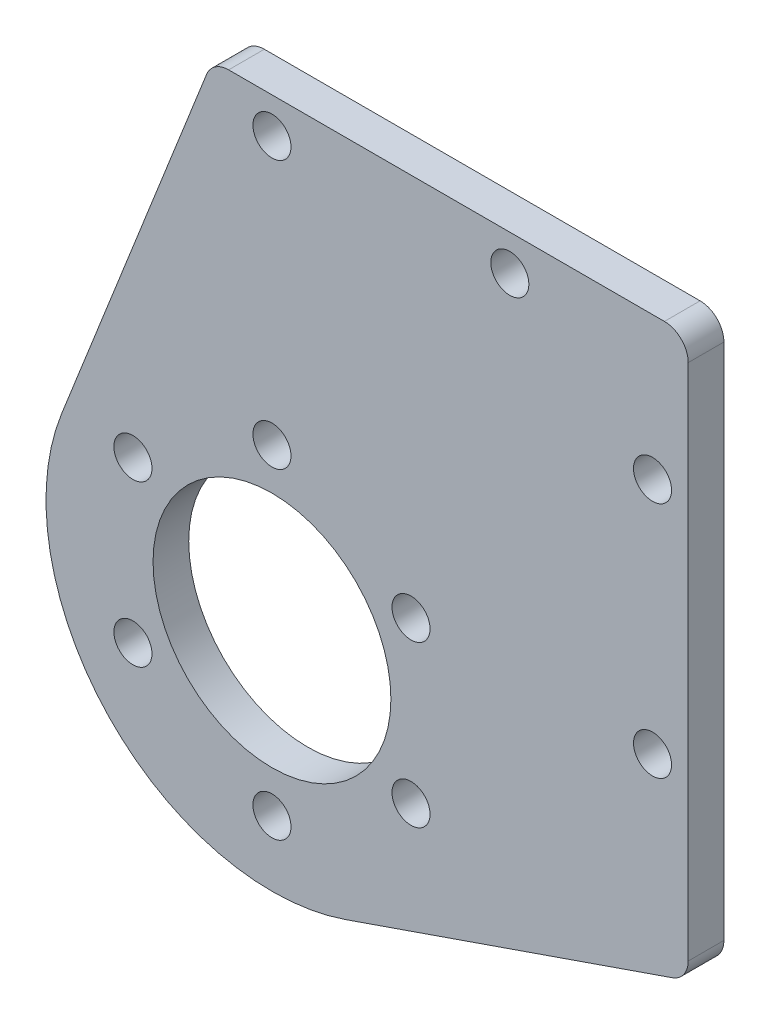
ISO-10303-21;
HEADER;
FILE_DESCRIPTION(('STEP AP214'),'2;1');
FILE_NAME('part.step','',(''),(''),'','','');
FILE_SCHEMA(('AUTOMOTIVE_DESIGN { 1 0 10303 214 1 1 1 1 }'));
ENDSEC;
DATA;
#1=APPLICATION_CONTEXT('core data for automotive mechanical design processes');
#2=APPLICATION_PROTOCOL_DEFINITION('international standard','automotive_design',2000,#1);
#3=PRODUCT_CONTEXT('',#1,'mechanical');
#4=PRODUCT('Part','Part','',(#3));
#5=PRODUCT_RELATED_PRODUCT_CATEGORY('part','',(#4));
#6=PRODUCT_DEFINITION_FORMATION('','',#4);
#7=PRODUCT_DEFINITION_CONTEXT('part definition',#1,'design');
#8=PRODUCT_DEFINITION('design','',#6,#7);
#9=PRODUCT_DEFINITION_SHAPE('','',#8);
#10=(LENGTH_UNIT() NAMED_UNIT(*) SI_UNIT(.MILLI.,.METRE.));
#11=(NAMED_UNIT(*) PLANE_ANGLE_UNIT() SI_UNIT($,.RADIAN.));
#12=(NAMED_UNIT(*) SI_UNIT($,.STERADIAN.) SOLID_ANGLE_UNIT());
#13=UNCERTAINTY_MEASURE_WITH_UNIT(LENGTH_MEASURE(1.E-05),#10,'distance_accuracy_value','');
#14=(GEOMETRIC_REPRESENTATION_CONTEXT(3) GLOBAL_UNCERTAINTY_ASSIGNED_CONTEXT((#13)) GLOBAL_UNIT_ASSIGNED_CONTEXT((#10,
#11,#12)) REPRESENTATION_CONTEXT('',''));
#15=CARTESIAN_POINT('',(0.,0.,0.));
#16=DIRECTION('',(0.,0.,1.));
#17=DIRECTION('',(1.,0.,0.));
#18=AXIS2_PLACEMENT_3D('',#15,#16,#17);
#19=CARTESIAN_POINT('',(0.,0.,3.));
#20=DIRECTION('',(0.,0.,1.));
#21=DIRECTION('',(1.,0.,0.));
#22=AXIS2_PLACEMENT_3D('',#19,#20,#21);
#23=PLANE('',#22);
#24=CARTESIAN_POINT('',(-11.6913429510899,-6.75000000000001,3.));
#25=DIRECTION('',(0.,0.,1.));
#26=DIRECTION('',(1.,0.,0.));
#27=AXIS2_PLACEMENT_3D('',#24,#25,#26);
#28=CIRCLE('',#27,1.6);
#29=CARTESIAN_POINT('',(-10.0913429510899,-6.75000000000001,3.));
#30=VERTEX_POINT('',#29);
#31=EDGE_CURVE('E183',#30,#30,#28,.T.);
#32=ORIENTED_EDGE('',*,*,#31,.F.);
#33=EDGE_LOOP('',(#32));
#34=FACE_BOUND('',#33,.T.);
#35=CARTESIAN_POINT('',(11.6913429510899,-6.75,3.));
#36=DIRECTION('',(0.,0.,1.));
#37=DIRECTION('',(1.,0.,0.));
#38=AXIS2_PLACEMENT_3D('',#35,#36,#37);
#39=CIRCLE('',#38,1.6);
#40=CARTESIAN_POINT('',(13.2913429510899,-6.75,3.));
#41=VERTEX_POINT('',#40);
#42=EDGE_CURVE('E195',#41,#41,#39,.T.);
#43=ORIENTED_EDGE('',*,*,#42,.F.);
#44=EDGE_LOOP('',(#43));
#45=FACE_BOUND('',#44,.T.);
#46=CARTESIAN_POINT('',(0.,13.5,3.));
#47=DIRECTION('',(0.,0.,1.));
#48=DIRECTION('',(1.,0.,0.));
#49=AXIS2_PLACEMENT_3D('',#46,#47,#48);
#50=CIRCLE('',#49,1.6);
#51=CARTESIAN_POINT('',(1.6,13.5,3.));
#52=VERTEX_POINT('',#51);
#53=EDGE_CURVE('E207',#52,#52,#50,.T.);
#54=ORIENTED_EDGE('',*,*,#53,.F.);
#55=EDGE_LOOP('',(#54));
#56=FACE_BOUND('',#55,.T.);
#57=CARTESIAN_POINT('',(0.,0.,3.));
#58=DIRECTION('',(0.,0.,1.));
#59=DIRECTION('',(1.,0.,0.));
#60=AXIS2_PLACEMENT_3D('',#57,#58,#59);
#61=CIRCLE('',#60,19.);
#62=CARTESIAN_POINT('',(-17.6669193120845,6.99142060101481,3.));
#63=VERTEX_POINT('',#62);
#64=CARTESIAN_POINT('',(6.20993789886327,-17.9565216924732,3.));
#65=VERTEX_POINT('',#64);
#66=EDGE_CURVE('E11',#63,#65,#61,.T.);
#67=ORIENTED_EDGE('',*,*,#66,.T.);
#68=DIRECTION('',(-0.945080089077538,-0.326838836782277,0.));
#69=VECTOR('',#68,1.);
#70=CARTESIAN_POINT('',(6.20993789886326,-17.9565216924732,3.));
#71=LINE('',#70,#69);
#72=CARTESIAN_POINT('',(33.6536776735646,-8.46560119950856,3.));
#73=VERTEX_POINT('',#72);
#74=EDGE_CURVE('E125',#73,#65,#71,.T.);
#75=ORIENTED_EDGE('',*,*,#74,.F.);
#76=CARTESIAN_POINT('',(33.,-6.57544102135349,3.));
#77=DIRECTION('',(0.,0.,1.));
#78=DIRECTION('',(1.,0.,0.));
#79=AXIS2_PLACEMENT_3D('',#76,#77,#78);
#80=CIRCLE('',#79,2.);
#81=CARTESIAN_POINT('',(35.,-6.57544102135349,3.));
#82=VERTEX_POINT('',#81);
#83=EDGE_CURVE('E110',#82,#73,#80,.F.);
#84=ORIENTED_EDGE('',*,*,#83,.F.);
#85=DIRECTION('',(0.,1.,0.));
#86=VECTOR('',#85,1.);
#87=CARTESIAN_POINT('',(35.,0.,3.));
#88=LINE('',#87,#86);
#89=CARTESIAN_POINT('',(35.,37.,3.));
#90=VERTEX_POINT('',#89);
#91=EDGE_CURVE('E123',#82,#90,#88,.T.);
#92=ORIENTED_EDGE('',*,*,#91,.T.);
#93=CARTESIAN_POINT('',(33.,37.,3.));
#94=DIRECTION('',(0.,0.,1.));
#95=DIRECTION('',(1.,0.,0.));
#96=AXIS2_PLACEMENT_3D('',#93,#94,#95);
#97=CIRCLE('',#96,2.00000000000001);
#98=CARTESIAN_POINT('',(33.,39.,3.));
#99=VERTEX_POINT('',#98);
#100=EDGE_CURVE('E130',#90,#99,#97,.T.);
#101=ORIENTED_EDGE('',*,*,#100,.T.);
#102=DIRECTION('',(-1.,0.,0.));
#103=VECTOR('',#102,1.);
#104=CARTESIAN_POINT('',(0.,39.,3.));
#105=LINE('',#104,#103);
#106=CARTESIAN_POINT('',(-3.64055762220285,39.,3.));
#107=VERTEX_POINT('',#106);
#108=EDGE_CURVE('E132',#99,#107,#105,.T.);
#109=ORIENTED_EDGE('',*,*,#108,.T.);
#110=CARTESIAN_POINT('',(-3.64055762220285,37.,3.));
#111=DIRECTION('',(0.,0.,1.));
#112=DIRECTION('',(1.,0.,0.));
#113=AXIS2_PLACEMENT_3D('',#110,#111,#112);
#114=CIRCLE('',#113,2.);
#115=CARTESIAN_POINT('',(-5.50023333926439,37.7359390106331,3.));
#116=VERTEX_POINT('',#115);
#117=EDGE_CURVE('E138',#107,#116,#114,.T.);
#118=ORIENTED_EDGE('',*,*,#117,.T.);
#119=DIRECTION('',(-0.367969505316569,-0.929837858530765,0.));
#120=VECTOR('',#119,1.);
#121=CARTESIAN_POINT('',(-17.6669193120845,6.99142060101481,3.));
#122=LINE('',#121,#120);
#123=EDGE_CURVE('E141',#116,#63,#122,.T.);
#124=ORIENTED_EDGE('',*,*,#123,.T.);
#125=EDGE_LOOP('',(#67,#75,#84,#92,#101,#109,#118,#124));
#126=FACE_BOUND('',#125,.T.);
#127=CARTESIAN_POINT('',(0.,0.,3.));
#128=DIRECTION('',(0.,0.,1.));
#129=DIRECTION('',(1.,0.,0.));
#130=AXIS2_PLACEMENT_3D('',#127,#128,#129);
#131=CIRCLE('',#130,10.);
#132=CARTESIAN_POINT('',(10.,0.,3.));
#133=VERTEX_POINT('',#132);
#134=EDGE_CURVE('E213',#133,#133,#131,.T.);
#135=ORIENTED_EDGE('',*,*,#134,.F.);
#136=EDGE_LOOP('',(#135));
#137=FACE_BOUND('',#136,.T.);
#138=CARTESIAN_POINT('',(11.6913429510899,6.75,3.));
#139=DIRECTION('',(0.,0.,1.));
#140=DIRECTION('',(1.,0.,0.));
#141=AXIS2_PLACEMENT_3D('',#138,#139,#140);
#142=CIRCLE('',#141,1.6);
#143=CARTESIAN_POINT('',(13.2913429510899,6.75,3.));
#144=VERTEX_POINT('',#143);
#145=EDGE_CURVE('E201',#144,#144,#142,.T.);
#146=ORIENTED_EDGE('',*,*,#145,.F.);
#147=EDGE_LOOP('',(#146));
#148=FACE_BOUND('',#147,.T.);
#149=CARTESIAN_POINT('',(0.,-13.5,3.));
#150=DIRECTION('',(0.,0.,1.));
#151=DIRECTION('',(1.,0.,0.));
#152=AXIS2_PLACEMENT_3D('',#149,#150,#151);
#153=CIRCLE('',#152,1.6);
#154=CARTESIAN_POINT('',(1.6,-13.5,3.));
#155=VERTEX_POINT('',#154);
#156=EDGE_CURVE('E189',#155,#155,#153,.T.);
#157=ORIENTED_EDGE('',*,*,#156,.F.);
#158=EDGE_LOOP('',(#157));
#159=FACE_BOUND('',#158,.T.);
#160=CARTESIAN_POINT('',(-11.6913429510899,6.75,3.));
#161=DIRECTION('',(0.,0.,1.));
#162=DIRECTION('',(1.,0.,0.));
#163=AXIS2_PLACEMENT_3D('',#160,#161,#162);
#164=CIRCLE('',#163,1.6);
#165=CARTESIAN_POINT('',(-10.0913429510899,6.75,3.));
#166=VERTEX_POINT('',#165);
#167=EDGE_CURVE('E175',#166,#166,#164,.T.);
#168=ORIENTED_EDGE('',*,*,#167,.F.);
#169=EDGE_LOOP('',(#168));
#170=FACE_BOUND('',#169,.T.);
#171=CARTESIAN_POINT('',(20.,36.,3.));
#172=DIRECTION('',(0.,0.,1.));
#173=DIRECTION('',(1.,0.,0.));
#174=AXIS2_PLACEMENT_3D('',#171,#172,#173);
#175=CIRCLE('',#174,1.6);
#176=CARTESIAN_POINT('',(21.6,36.,3.));
#177=VERTEX_POINT('',#176);
#178=EDGE_CURVE('E145',#177,#177,#175,.T.);
#179=ORIENTED_EDGE('',*,*,#178,.F.);
#180=EDGE_LOOP('',(#179));
#181=FACE_BOUND('',#180,.T.);
#182=CARTESIAN_POINT('',(0.,36.,3.));
#183=DIRECTION('',(0.,0.,1.));
#184=DIRECTION('',(1.,0.,0.));
#185=AXIS2_PLACEMENT_3D('',#182,#183,#184);
#186=CIRCLE('',#185,1.6);
#187=CARTESIAN_POINT('',(1.6,36.,3.));
#188=VERTEX_POINT('',#187);
#189=EDGE_CURVE('E148',#188,#188,#186,.T.);
#190=ORIENTED_EDGE('',*,*,#189,.F.);
#191=EDGE_LOOP('',(#190));
#192=FACE_BOUND('',#191,.T.);
#193=CARTESIAN_POINT('',(32.,27.,3.));
#194=DIRECTION('',(0.,0.,1.));
#195=DIRECTION('',(1.,0.,0.));
#196=AXIS2_PLACEMENT_3D('',#193,#194,#195);
#197=CIRCLE('',#196,1.6);
#198=CARTESIAN_POINT('',(33.6,27.,3.));
#199=VERTEX_POINT('',#198);
#200=EDGE_CURVE('E151',#199,#199,#197,.T.);
#201=ORIENTED_EDGE('',*,*,#200,.F.);
#202=EDGE_LOOP('',(#201));
#203=FACE_BOUND('',#202,.T.);
#204=CARTESIAN_POINT('',(32.,7.00000000000001,3.));
#205=DIRECTION('',(0.,0.,1.));
#206=DIRECTION('',(1.,0.,0.));
#207=AXIS2_PLACEMENT_3D('',#204,#205,#206);
#208=CIRCLE('',#207,1.6);
#209=CARTESIAN_POINT('',(33.6,7.00000000000001,3.));
#210=VERTEX_POINT('',#209);
#211=EDGE_CURVE('E116',#210,#210,#208,.T.);
#212=ORIENTED_EDGE('',*,*,#211,.F.);
#213=EDGE_LOOP('',(#212));
#214=FACE_BOUND('',#213,.T.);
#215=ADVANCED_FACE('F43',(#34,#45,#56,#126,#137,#148,#159,#170,#181,#192,#203,#214),#23,.T.);
#216=CARTESIAN_POINT('',(0.,0.,0.));
#217=DIRECTION('',(0.,0.,1.));
#218=DIRECTION('',(1.,0.,0.));
#219=AXIS2_PLACEMENT_3D('',#216,#217,#218);
#220=PLANE('',#219);
#221=CARTESIAN_POINT('',(0.,0.,0.));
#222=DIRECTION('',(0.,0.,1.));
#223=DIRECTION('',(1.,0.,0.));
#224=AXIS2_PLACEMENT_3D('',#221,#222,#223);
#225=CIRCLE('',#224,19.);
#226=CARTESIAN_POINT('',(-17.6669193120845,6.99142060101481,0.));
#227=VERTEX_POINT('',#226);
#228=CARTESIAN_POINT('',(6.20993789886327,-17.9565216924732,0.));
#229=VERTEX_POINT('',#228);
#230=EDGE_CURVE('E47',#227,#229,#225,.T.);
#231=ORIENTED_EDGE('',*,*,#230,.F.);
#232=DIRECTION('',(0.367969505316569,0.929837858530766,0.));
#233=VECTOR('',#232,1.);
#234=CARTESIAN_POINT('',(-17.6669193120845,6.99142060101481,0.));
#235=LINE('',#234,#233);
#236=CARTESIAN_POINT('',(-5.50023333926438,37.7359390106331,0.));
#237=VERTEX_POINT('',#236);
#238=EDGE_CURVE('E279',#227,#237,#235,.T.);
#239=ORIENTED_EDGE('',*,*,#238,.T.);
#240=CARTESIAN_POINT('',(-3.64055762220285,37.,0.));
#241=DIRECTION('',(0.,0.,1.));
#242=DIRECTION('',(1.,0.,0.));
#243=AXIS2_PLACEMENT_3D('',#240,#241,#242);
#244=CIRCLE('',#243,2.);
#245=CARTESIAN_POINT('',(-3.64055762220285,39.,0.));
#246=VERTEX_POINT('',#245);
#247=EDGE_CURVE('E281',#237,#246,#244,.F.);
#248=ORIENTED_EDGE('',*,*,#247,.T.);
#249=DIRECTION('',(1.,0.,0.));
#250=VECTOR('',#249,1.);
#251=CARTESIAN_POINT('',(0.,39.,0.));
#252=LINE('',#251,#250);
#253=CARTESIAN_POINT('',(33.,39.,0.));
#254=VERTEX_POINT('',#253);
#255=EDGE_CURVE('E283',#246,#254,#252,.T.);
#256=ORIENTED_EDGE('',*,*,#255,.T.);
#257=CARTESIAN_POINT('',(33.,37.,0.));
#258=DIRECTION('',(0.,0.,1.));
#259=DIRECTION('',(1.,0.,0.));
#260=AXIS2_PLACEMENT_3D('',#257,#258,#259);
#261=CIRCLE('',#260,2.00000000000001);
#262=CARTESIAN_POINT('',(35.,37.,0.));
#263=VERTEX_POINT('',#262);
#264=EDGE_CURVE('E158',#254,#263,#261,.F.);
#265=ORIENTED_EDGE('',*,*,#264,.T.);
#266=DIRECTION('',(0.,-1.,0.));
#267=VECTOR('',#266,1.);
#268=CARTESIAN_POINT('',(35.,0.,0.));
#269=LINE('',#268,#267);
#270=CARTESIAN_POINT('',(35.,-6.57544102135349,0.));
#271=VERTEX_POINT('',#270);
#272=EDGE_CURVE('E273',#263,#271,#269,.T.);
#273=ORIENTED_EDGE('',*,*,#272,.T.);
#274=CARTESIAN_POINT('',(33.,-6.57544102135349,0.));
#275=DIRECTION('',(0.,0.,1.));
#276=DIRECTION('',(1.,0.,0.));
#277=AXIS2_PLACEMENT_3D('',#274,#275,#276);
#278=CIRCLE('',#277,2.);
#279=CARTESIAN_POINT('',(33.6536776735646,-8.46560119950856,0.));
#280=VERTEX_POINT('',#279);
#281=EDGE_CURVE('E111',#280,#271,#278,.T.);
#282=ORIENTED_EDGE('',*,*,#281,.F.);
#283=DIRECTION('',(0.945080089077538,0.326838836782277,0.));
#284=VECTOR('',#283,1.);
#285=CARTESIAN_POINT('',(6.20993789886326,-17.9565216924732,0.));
#286=LINE('',#285,#284);
#287=EDGE_CURVE('E276',#229,#280,#286,.T.);
#288=ORIENTED_EDGE('',*,*,#287,.F.);
#289=EDGE_LOOP('',(#231,#239,#248,#256,#265,#273,#282,#288));
#290=FACE_BOUND('',#289,.T.);
#291=CARTESIAN_POINT('',(0.,0.,0.));
#292=DIRECTION('',(0.,0.,1.));
#293=DIRECTION('',(1.,0.,0.));
#294=AXIS2_PLACEMENT_3D('',#291,#292,#293);
#295=CIRCLE('',#294,10.);
#296=CARTESIAN_POINT('',(10.,0.,0.));
#297=VERTEX_POINT('',#296);
#298=EDGE_CURVE('E210',#297,#297,#295,.T.);
#299=ORIENTED_EDGE('',*,*,#298,.T.);
#300=EDGE_LOOP('',(#299));
#301=FACE_BOUND('',#300,.T.);
#302=CARTESIAN_POINT('',(0.,13.5,0.));
#303=DIRECTION('',(0.,0.,1.));
#304=DIRECTION('',(1.,0.,0.));
#305=AXIS2_PLACEMENT_3D('',#302,#303,#304);
#306=CIRCLE('',#305,1.6);
#307=CARTESIAN_POINT('',(1.6,13.5,0.));
#308=VERTEX_POINT('',#307);
#309=EDGE_CURVE('E204',#308,#308,#306,.T.);
#310=ORIENTED_EDGE('',*,*,#309,.T.);
#311=EDGE_LOOP('',(#310));
#312=FACE_BOUND('',#311,.T.);
#313=CARTESIAN_POINT('',(11.6913429510899,6.75,0.));
#314=DIRECTION('',(0.,0.,1.));
#315=DIRECTION('',(1.,0.,0.));
#316=AXIS2_PLACEMENT_3D('',#313,#314,#315);
#317=CIRCLE('',#316,1.6);
#318=CARTESIAN_POINT('',(13.2913429510899,6.75,0.));
#319=VERTEX_POINT('',#318);
#320=EDGE_CURVE('E198',#319,#319,#317,.T.);
#321=ORIENTED_EDGE('',*,*,#320,.T.);
#322=EDGE_LOOP('',(#321));
#323=FACE_BOUND('',#322,.T.);
#324=CARTESIAN_POINT('',(11.6913429510899,-6.75,0.));
#325=DIRECTION('',(0.,0.,1.));
#326=DIRECTION('',(1.,0.,0.));
#327=AXIS2_PLACEMENT_3D('',#324,#325,#326);
#328=CIRCLE('',#327,1.6);
#329=CARTESIAN_POINT('',(13.2913429510899,-6.75,0.));
#330=VERTEX_POINT('',#329);
#331=EDGE_CURVE('E192',#330,#330,#328,.T.);
#332=ORIENTED_EDGE('',*,*,#331,.T.);
#333=EDGE_LOOP('',(#332));
#334=FACE_BOUND('',#333,.T.);
#335=CARTESIAN_POINT('',(0.,-13.5,0.));
#336=DIRECTION('',(0.,0.,1.));
#337=DIRECTION('',(1.,0.,0.));
#338=AXIS2_PLACEMENT_3D('',#335,#336,#337);
#339=CIRCLE('',#338,1.6);
#340=CARTESIAN_POINT('',(1.6,-13.5,0.));
#341=VERTEX_POINT('',#340);
#342=EDGE_CURVE('E186',#341,#341,#339,.T.);
#343=ORIENTED_EDGE('',*,*,#342,.T.);
#344=EDGE_LOOP('',(#343));
#345=FACE_BOUND('',#344,.T.);
#346=CARTESIAN_POINT('',(-11.6913429510899,-6.75000000000001,0.));
#347=DIRECTION('',(0.,0.,1.));
#348=DIRECTION('',(1.,0.,0.));
#349=AXIS2_PLACEMENT_3D('',#346,#347,#348);
#350=CIRCLE('',#349,1.6);
#351=CARTESIAN_POINT('',(-10.0913429510899,-6.75000000000001,0.));
#352=VERTEX_POINT('',#351);
#353=EDGE_CURVE('E178',#352,#352,#350,.T.);
#354=ORIENTED_EDGE('',*,*,#353,.T.);
#355=EDGE_LOOP('',(#354));
#356=FACE_BOUND('',#355,.T.);
#357=CARTESIAN_POINT('',(-11.6913429510899,6.75,0.));
#358=DIRECTION('',(0.,0.,1.));
#359=DIRECTION('',(1.,0.,0.));
#360=AXIS2_PLACEMENT_3D('',#357,#358,#359);
#361=CIRCLE('',#360,1.6);
#362=CARTESIAN_POINT('',(-10.0913429510899,6.75,0.));
#363=VERTEX_POINT('',#362);
#364=EDGE_CURVE('E179',#363,#363,#361,.T.);
#365=ORIENTED_EDGE('',*,*,#364,.T.);
#366=EDGE_LOOP('',(#365));
#367=FACE_BOUND('',#366,.T.);
#368=CARTESIAN_POINT('',(0.,36.,0.));
#369=DIRECTION('',(0.,0.,1.));
#370=DIRECTION('',(1.,0.,0.));
#371=AXIS2_PLACEMENT_3D('',#368,#369,#370);
#372=CIRCLE('',#371,1.6);
#373=CARTESIAN_POINT('',(1.6,36.,0.));
#374=VERTEX_POINT('',#373);
#375=EDGE_CURVE('E174',#374,#374,#372,.F.);
#376=ORIENTED_EDGE('',*,*,#375,.F.);
#377=EDGE_LOOP('',(#376));
#378=FACE_BOUND('',#377,.T.);
#379=CARTESIAN_POINT('',(32.,7.00000000000001,0.));
#380=DIRECTION('',(0.,0.,1.));
#381=DIRECTION('',(1.,0.,0.));
#382=AXIS2_PLACEMENT_3D('',#379,#380,#381);
#383=CIRCLE('',#382,1.6);
#384=CARTESIAN_POINT('',(33.6,7.00000000000001,0.));
#385=VERTEX_POINT('',#384);
#386=EDGE_CURVE('E170',#385,#385,#383,.F.);
#387=ORIENTED_EDGE('',*,*,#386,.F.);
#388=EDGE_LOOP('',(#387));
#389=FACE_BOUND('',#388,.T.);
#390=CARTESIAN_POINT('',(20.,36.,0.));
#391=DIRECTION('',(0.,0.,1.));
#392=DIRECTION('',(1.,0.,0.));
#393=AXIS2_PLACEMENT_3D('',#390,#391,#392);
#394=CIRCLE('',#393,1.6);
#395=CARTESIAN_POINT('',(21.6,36.,0.));
#396=VERTEX_POINT('',#395);
#397=EDGE_CURVE('E173',#396,#396,#394,.F.);
#398=ORIENTED_EDGE('',*,*,#397,.F.);
#399=EDGE_LOOP('',(#398));
#400=FACE_BOUND('',#399,.T.);
#401=CARTESIAN_POINT('',(32.,27.,0.));
#402=DIRECTION('',(0.,0.,1.));
#403=DIRECTION('',(1.,0.,0.));
#404=AXIS2_PLACEMENT_3D('',#401,#402,#403);
#405=CIRCLE('',#404,1.6);
#406=CARTESIAN_POINT('',(33.6,27.,0.));
#407=VERTEX_POINT('',#406);
#408=EDGE_CURVE('E182',#407,#407,#405,.F.);
#409=ORIENTED_EDGE('',*,*,#408,.F.);
#410=EDGE_LOOP('',(#409));
#411=FACE_BOUND('',#410,.T.);
#412=ADVANCED_FACE('F219',(#290,#301,#312,#323,#334,#345,#356,#367,#378,#389,#400,#411),#220,.F.);
#413=CARTESIAN_POINT('',(0.,0.,3.));
#414=DIRECTION('',(0.,0.,-1.));
#415=DIRECTION('',(-1.,0.,0.));
#416=AXIS2_PLACEMENT_3D('',#413,#414,#415);
#417=CYLINDRICAL_SURFACE('',#416,19.);
#418=ORIENTED_EDGE('',*,*,#66,.F.);
#419=DIRECTION('',(0.,0.,1.));
#420=VECTOR('',#419,1.);
#421=CARTESIAN_POINT('',(-17.6669193120845,6.99142060101481,-77.5748010189572));
#422=LINE('',#421,#420);
#423=EDGE_CURVE('E160',#227,#63,#422,.T.);
#424=ORIENTED_EDGE('',*,*,#423,.F.);
#425=ORIENTED_EDGE('',*,*,#230,.T.);
#426=DIRECTION('',(0.,0.,1.));
#427=VECTOR('',#426,1.);
#428=CARTESIAN_POINT('',(6.20993789886326,-17.9565216924732,-77.5748010189572));
#429=LINE('',#428,#427);
#430=EDGE_CURVE('E62',#229,#65,#429,.T.);
#431=ORIENTED_EDGE('',*,*,#430,.T.);
#432=EDGE_LOOP('',(#418,#424,#425,#431));
#433=FACE_BOUND('',#432,.T.);
#434=ADVANCED_FACE('F45',(#433),#417,.T.);
#435=CARTESIAN_POINT('',(0.,0.,3.));
#436=DIRECTION('',(0.,0.,-1.));
#437=DIRECTION('',(-1.,0.,0.));
#438=AXIS2_PLACEMENT_3D('',#435,#436,#437);
#439=CYLINDRICAL_SURFACE('',#438,10.);
#440=ORIENTED_EDGE('',*,*,#134,.T.);
#441=EDGE_LOOP('',(#440));
#442=FACE_BOUND('',#441,.T.);
#443=ORIENTED_EDGE('',*,*,#298,.F.);
#444=EDGE_LOOP('',(#443));
#445=FACE_BOUND('',#444,.T.);
#446=ADVANCED_FACE('F222',(#442,#445),#439,.F.);
#447=CARTESIAN_POINT('',(0.,13.5,3.));
#448=DIRECTION('',(0.,0.,-1.));
#449=DIRECTION('',(-1.,0.,0.));
#450=AXIS2_PLACEMENT_3D('',#447,#448,#449);
#451=CYLINDRICAL_SURFACE('',#450,1.6);
#452=ORIENTED_EDGE('',*,*,#53,.T.);
#453=EDGE_LOOP('',(#452));
#454=FACE_BOUND('',#453,.T.);
#455=ORIENTED_EDGE('',*,*,#309,.F.);
#456=EDGE_LOOP('',(#455));
#457=FACE_BOUND('',#456,.T.);
#458=ADVANCED_FACE('F224',(#454,#457),#451,.F.);
#459=CARTESIAN_POINT('',(11.6913429510899,6.75,3.));
#460=DIRECTION('',(0.,0.,-1.));
#461=DIRECTION('',(-1.,0.,0.));
#462=AXIS2_PLACEMENT_3D('',#459,#460,#461);
#463=CYLINDRICAL_SURFACE('',#462,1.6);
#464=ORIENTED_EDGE('',*,*,#145,.T.);
#465=EDGE_LOOP('',(#464));
#466=FACE_BOUND('',#465,.T.);
#467=ORIENTED_EDGE('',*,*,#320,.F.);
#468=EDGE_LOOP('',(#467));
#469=FACE_BOUND('',#468,.T.);
#470=ADVANCED_FACE('F230',(#466,#469),#463,.F.);
#471=CARTESIAN_POINT('',(11.6913429510899,-6.75,3.));
#472=DIRECTION('',(0.,0.,-1.));
#473=DIRECTION('',(-1.,0.,0.));
#474=AXIS2_PLACEMENT_3D('',#471,#472,#473);
#475=CYLINDRICAL_SURFACE('',#474,1.6);
#476=ORIENTED_EDGE('',*,*,#42,.T.);
#477=EDGE_LOOP('',(#476));
#478=FACE_BOUND('',#477,.T.);
#479=ORIENTED_EDGE('',*,*,#331,.F.);
#480=EDGE_LOOP('',(#479));
#481=FACE_BOUND('',#480,.T.);
#482=ADVANCED_FACE('F338',(#478,#481),#475,.F.);
#483=CARTESIAN_POINT('',(0.,-13.5,3.));
#484=DIRECTION('',(0.,0.,-1.));
#485=DIRECTION('',(-1.,0.,0.));
#486=AXIS2_PLACEMENT_3D('',#483,#484,#485);
#487=CYLINDRICAL_SURFACE('',#486,1.6);
#488=ORIENTED_EDGE('',*,*,#156,.T.);
#489=EDGE_LOOP('',(#488));
#490=FACE_BOUND('',#489,.T.);
#491=ORIENTED_EDGE('',*,*,#342,.F.);
#492=EDGE_LOOP('',(#491));
#493=FACE_BOUND('',#492,.T.);
#494=ADVANCED_FACE('F334',(#490,#493),#487,.F.);
#495=CARTESIAN_POINT('',(-11.6913429510899,-6.75000000000001,3.));
#496=DIRECTION('',(0.,0.,-1.));
#497=DIRECTION('',(-1.,0.,0.));
#498=AXIS2_PLACEMENT_3D('',#495,#496,#497);
#499=CYLINDRICAL_SURFACE('',#498,1.6);
#500=ORIENTED_EDGE('',*,*,#31,.T.);
#501=EDGE_LOOP('',(#500));
#502=FACE_BOUND('',#501,.T.);
#503=ORIENTED_EDGE('',*,*,#353,.F.);
#504=EDGE_LOOP('',(#503));
#505=FACE_BOUND('',#504,.T.);
#506=ADVANCED_FACE('F330',(#502,#505),#499,.F.);
#507=CARTESIAN_POINT('',(-11.6913429510899,6.75,3.));
#508=DIRECTION('',(0.,0.,-1.));
#509=DIRECTION('',(-1.,0.,0.));
#510=AXIS2_PLACEMENT_3D('',#507,#508,#509);
#511=CYLINDRICAL_SURFACE('',#510,1.6);
#512=ORIENTED_EDGE('',*,*,#167,.T.);
#513=EDGE_LOOP('',(#512));
#514=FACE_BOUND('',#513,.T.);
#515=ORIENTED_EDGE('',*,*,#364,.F.);
#516=EDGE_LOOP('',(#515));
#517=FACE_BOUND('',#516,.T.);
#518=ADVANCED_FACE('F327',(#514,#517),#511,.F.);
#519=CARTESIAN_POINT('',(32.,27.,-77.5748010189572));
#520=DIRECTION('',(0.,0.,1.));
#521=DIRECTION('',(1.,0.,0.));
#522=AXIS2_PLACEMENT_3D('',#519,#520,#521);
#523=CYLINDRICAL_SURFACE('',#522,1.6);
#524=ORIENTED_EDGE('',*,*,#408,.T.);
#525=EDGE_LOOP('',(#524));
#526=FACE_BOUND('',#525,.T.);
#527=ORIENTED_EDGE('',*,*,#200,.T.);
#528=EDGE_LOOP('',(#527));
#529=FACE_BOUND('',#528,.T.);
#530=ADVANCED_FACE('F329',(#526,#529),#523,.F.);
#531=CARTESIAN_POINT('',(0.,36.,-77.5748010189572));
#532=DIRECTION('',(0.,0.,1.));
#533=DIRECTION('',(1.,0.,0.));
#534=AXIS2_PLACEMENT_3D('',#531,#532,#533);
#535=CYLINDRICAL_SURFACE('',#534,1.6);
#536=ORIENTED_EDGE('',*,*,#375,.T.);
#537=EDGE_LOOP('',(#536));
#538=FACE_BOUND('',#537,.T.);
#539=ORIENTED_EDGE('',*,*,#189,.T.);
#540=EDGE_LOOP('',(#539));
#541=FACE_BOUND('',#540,.T.);
#542=ADVANCED_FACE('F370',(#538,#541),#535,.F.);
#543=CARTESIAN_POINT('',(20.,36.,-77.5748010189572));
#544=DIRECTION('',(0.,0.,1.));
#545=DIRECTION('',(1.,0.,0.));
#546=AXIS2_PLACEMENT_3D('',#543,#544,#545);
#547=CYLINDRICAL_SURFACE('',#546,1.6);
#548=ORIENTED_EDGE('',*,*,#397,.T.);
#549=EDGE_LOOP('',(#548));
#550=FACE_BOUND('',#549,.T.);
#551=ORIENTED_EDGE('',*,*,#178,.T.);
#552=EDGE_LOOP('',(#551));
#553=FACE_BOUND('',#552,.T.);
#554=ADVANCED_FACE('F316',(#550,#553),#547,.F.);
#555=CARTESIAN_POINT('',(35.,0.,-77.5748010189572));
#556=DIRECTION('',(1.,0.,0.));
#557=DIRECTION('',(0.,0.,-1.));
#558=AXIS2_PLACEMENT_3D('',#555,#556,#557);
#559=PLANE('',#558);
#560=ORIENTED_EDGE('',*,*,#272,.F.);
#561=DIRECTION('',(0.,0.,1.));
#562=VECTOR('',#561,1.);
#563=CARTESIAN_POINT('',(35.,37.,-77.5748010189572));
#564=LINE('',#563,#562);
#565=EDGE_CURVE('E115',#263,#90,#564,.T.);
#566=ORIENTED_EDGE('',*,*,#565,.T.);
#567=ORIENTED_EDGE('',*,*,#91,.F.);
#568=DIRECTION('',(0.,0.,1.));
#569=VECTOR('',#568,1.);
#570=CARTESIAN_POINT('',(35.,-6.57544102135349,-77.5748010189572));
#571=LINE('',#570,#569);
#572=EDGE_CURVE('E106',#271,#82,#571,.T.);
#573=ORIENTED_EDGE('',*,*,#572,.F.);
#574=EDGE_LOOP('',(#560,#566,#567,#573));
#575=FACE_BOUND('',#574,.T.);
#576=ADVANCED_FACE('F127',(#575),#559,.T.);
#577=CARTESIAN_POINT('',(33.,37.,-77.5748010189572));
#578=DIRECTION('',(0.,0.,1.));
#579=DIRECTION('',(1.,0.,0.));
#580=AXIS2_PLACEMENT_3D('',#577,#578,#579);
#581=CYLINDRICAL_SURFACE('',#580,2.00000000000001);
#582=ORIENTED_EDGE('',*,*,#264,.F.);
#583=DIRECTION('',(0.,0.,1.));
#584=VECTOR('',#583,1.);
#585=CARTESIAN_POINT('',(33.,39.,-77.5748010189572));
#586=LINE('',#585,#584);
#587=EDGE_CURVE('E167',#254,#99,#586,.T.);
#588=ORIENTED_EDGE('',*,*,#587,.T.);
#589=ORIENTED_EDGE('',*,*,#100,.F.);
#590=ORIENTED_EDGE('',*,*,#565,.F.);
#591=EDGE_LOOP('',(#582,#588,#589,#590));
#592=FACE_BOUND('',#591,.T.);
#593=ADVANCED_FACE('F290',(#592),#581,.T.);
#594=CARTESIAN_POINT('',(0.,39.,-77.5748010189572));
#595=DIRECTION('',(0.,1.,0.));
#596=DIRECTION('',(-1.,0.,0.));
#597=AXIS2_PLACEMENT_3D('',#594,#595,#596);
#598=PLANE('',#597);
#599=ORIENTED_EDGE('',*,*,#255,.F.);
#600=DIRECTION('',(0.,0.,1.));
#601=VECTOR('',#600,1.);
#602=CARTESIAN_POINT('',(-3.64055762220285,39.,-77.5748010189572));
#603=LINE('',#602,#601);
#604=EDGE_CURVE('E165',#246,#107,#603,.T.);
#605=ORIENTED_EDGE('',*,*,#604,.T.);
#606=ORIENTED_EDGE('',*,*,#108,.F.);
#607=ORIENTED_EDGE('',*,*,#587,.F.);
#608=EDGE_LOOP('',(#599,#605,#606,#607));
#609=FACE_BOUND('',#608,.T.);
#610=ADVANCED_FACE('F294',(#609),#598,.T.);
#611=CARTESIAN_POINT('',(-3.64055762220285,37.,-77.5748010189572));
#612=DIRECTION('',(0.,0.,1.));
#613=DIRECTION('',(1.,0.,0.));
#614=AXIS2_PLACEMENT_3D('',#611,#612,#613);
#615=CYLINDRICAL_SURFACE('',#614,2.);
#616=ORIENTED_EDGE('',*,*,#247,.F.);
#617=DIRECTION('',(0.,0.,1.));
#618=VECTOR('',#617,1.);
#619=CARTESIAN_POINT('',(-5.50023333926439,37.7359390106331,-77.5748010189572));
#620=LINE('',#619,#618);
#621=EDGE_CURVE('E163',#237,#116,#620,.T.);
#622=ORIENTED_EDGE('',*,*,#621,.T.);
#623=ORIENTED_EDGE('',*,*,#117,.F.);
#624=ORIENTED_EDGE('',*,*,#604,.F.);
#625=EDGE_LOOP('',(#616,#622,#623,#624));
#626=FACE_BOUND('',#625,.T.);
#627=ADVANCED_FACE('F298',(#626),#615,.T.);
#628=CARTESIAN_POINT('',(-17.6669193120845,6.99142060101481,-77.5748010189572));
#629=DIRECTION('',(-0.929837858530765,0.367969505316569,0.));
#630=DIRECTION('',(-0.367969505316569,-0.929837858530766,0.));
#631=AXIS2_PLACEMENT_3D('',#628,#629,#630);
#632=PLANE('',#631);
#633=ORIENTED_EDGE('',*,*,#238,.F.);
#634=ORIENTED_EDGE('',*,*,#423,.T.);
#635=ORIENTED_EDGE('',*,*,#123,.F.);
#636=ORIENTED_EDGE('',*,*,#621,.F.);
#637=EDGE_LOOP('',(#633,#634,#635,#636));
#638=FACE_BOUND('',#637,.T.);
#639=ADVANCED_FACE('F303',(#638),#632,.T.);
#640=CARTESIAN_POINT('',(6.20993789886326,-17.9565216924732,-77.5748010189572));
#641=DIRECTION('',(-0.326838836782277,0.945080089077538,0.));
#642=DIRECTION('',(-0.945080089077538,-0.326838836782277,0.));
#643=AXIS2_PLACEMENT_3D('',#640,#641,#642);
#644=PLANE('',#643);
#645=ORIENTED_EDGE('',*,*,#430,.F.);
#646=ORIENTED_EDGE('',*,*,#287,.T.);
#647=DIRECTION('',(0.,0.,1.));
#648=VECTOR('',#647,1.);
#649=CARTESIAN_POINT('',(33.6536776735646,-8.46560119950856,-77.5748010189572));
#650=LINE('',#649,#648);
#651=EDGE_CURVE('E156',#280,#73,#650,.T.);
#652=ORIENTED_EDGE('',*,*,#651,.T.);
#653=ORIENTED_EDGE('',*,*,#74,.T.);
#654=EDGE_LOOP('',(#645,#646,#652,#653));
#655=FACE_BOUND('',#654,.T.);
#656=ADVANCED_FACE('F305',(#655),#644,.F.);
#657=CARTESIAN_POINT('',(33.,-6.57544102135349,-77.5748010189572));
#658=DIRECTION('',(0.,0.,1.));
#659=DIRECTION('',(1.,0.,0.));
#660=AXIS2_PLACEMENT_3D('',#657,#658,#659);
#661=CYLINDRICAL_SURFACE('',#660,2.);
#662=ORIENTED_EDGE('',*,*,#651,.F.);
#663=ORIENTED_EDGE('',*,*,#281,.T.);
#664=ORIENTED_EDGE('',*,*,#572,.T.);
#665=ORIENTED_EDGE('',*,*,#83,.T.);
#666=EDGE_LOOP('',(#662,#663,#664,#665));
#667=FACE_BOUND('',#666,.T.);
#668=ADVANCED_FACE('F109',(#667),#661,.T.);
#669=CARTESIAN_POINT('',(32.,7.00000000000001,-77.5748010189572));
#670=DIRECTION('',(0.,0.,1.));
#671=DIRECTION('',(1.,0.,0.));
#672=AXIS2_PLACEMENT_3D('',#669,#670,#671);
#673=CYLINDRICAL_SURFACE('',#672,1.6);
#674=ORIENTED_EDGE('',*,*,#386,.T.);
#675=EDGE_LOOP('',(#674));
#676=FACE_BOUND('',#675,.T.);
#677=ORIENTED_EDGE('',*,*,#211,.T.);
#678=EDGE_LOOP('',(#677));
#679=FACE_BOUND('',#678,.T.);
#680=ADVANCED_FACE('F312',(#676,#679),#673,.F.);
#681=CLOSED_SHELL('',(#215,#412,#434,#446,#458,#470,#482,#494,#506,#518,#530,#542,#554,#576,
#593,#610,#627,#639,#656,#668,#680));
#682=MANIFOLD_SOLID_BREP('B2',#681);
#683=ADVANCED_BREP_SHAPE_REPRESENTATION('',(#18,#682),#14);
#684=SHAPE_DEFINITION_REPRESENTATION(#9,#683);
ENDSEC;
END-ISO-10303-21;
